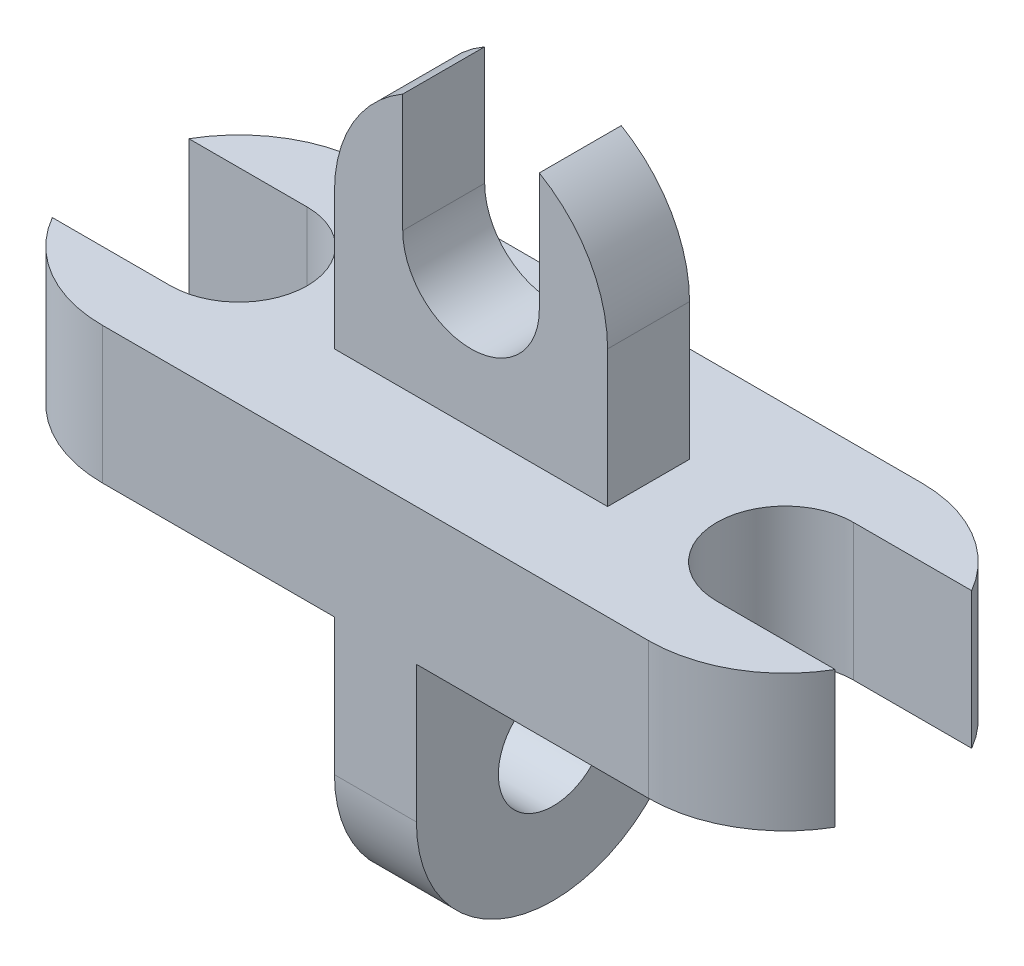
ISO-10303-21;
HEADER;
FILE_DESCRIPTION(('STEP AP214'),'2;1');
FILE_NAME('part.step','',(''),(''),'','','');
FILE_SCHEMA(('AUTOMOTIVE_DESIGN { 1 0 10303 214 1 1 1 1 }'));
ENDSEC;
DATA;
#1=APPLICATION_CONTEXT('core data for automotive mechanical design processes');
#2=APPLICATION_PROTOCOL_DEFINITION('international standard','automotive_design',2000,#1);
#3=PRODUCT_CONTEXT('',#1,'mechanical');
#4=PRODUCT('Part','Part','',(#3));
#5=PRODUCT_RELATED_PRODUCT_CATEGORY('part','',(#4));
#6=PRODUCT_DEFINITION_FORMATION('','',#4);
#7=PRODUCT_DEFINITION_CONTEXT('part definition',#1,'design');
#8=PRODUCT_DEFINITION('design','',#6,#7);
#9=PRODUCT_DEFINITION_SHAPE('','',#8);
#10=(LENGTH_UNIT() NAMED_UNIT(*) SI_UNIT(.MILLI.,.METRE.));
#11=(NAMED_UNIT(*) PLANE_ANGLE_UNIT() SI_UNIT($,.RADIAN.));
#12=(NAMED_UNIT(*) SI_UNIT($,.STERADIAN.) SOLID_ANGLE_UNIT());
#13=UNCERTAINTY_MEASURE_WITH_UNIT(LENGTH_MEASURE(1.E-05),#10,'distance_accuracy_value','');
#14=(GEOMETRIC_REPRESENTATION_CONTEXT(3) GLOBAL_UNCERTAINTY_ASSIGNED_CONTEXT((#13)) GLOBAL_UNIT_ASSIGNED_CONTEXT((#10,
#11,#12)) REPRESENTATION_CONTEXT('',''));
#15=CARTESIAN_POINT('',(0.,0.,0.));
#16=DIRECTION('',(0.,0.,1.));
#17=DIRECTION('',(1.,0.,0.));
#18=AXIS2_PLACEMENT_3D('',#15,#16,#17);
#19=CARTESIAN_POINT('',(-100.,-25.,0.));
#20=DIRECTION('',(0.,1.,0.));
#21=DIRECTION('',(0.,0.,1.));
#22=AXIS2_PLACEMENT_3D('',#19,#20,#21);
#23=CYLINDRICAL_SURFACE('',#22,50.);
#24=DIRECTION('',(0.,1.,0.));
#25=VECTOR('',#24,1.);
#26=CARTESIAN_POINT('',(-143.301270189222,-125.,-25.));
#27=LINE('',#26,#25);
#28=CARTESIAN_POINT('',(-143.301270189222,-25.,-25.));
#29=VERTEX_POINT('',#28);
#30=CARTESIAN_POINT('',(-143.301270189222,25.,-25.));
#31=VERTEX_POINT('',#30);
#32=EDGE_CURVE('E252',#29,#31,#27,.T.);
#33=ORIENTED_EDGE('',*,*,#32,.T.);
#34=CARTESIAN_POINT('',(-100.,25.,0.));
#35=DIRECTION('',(0.,1.,0.));
#36=DIRECTION('',(0.,0.,1.));
#37=AXIS2_PLACEMENT_3D('',#34,#35,#36);
#38=CIRCLE('',#37,50.);
#39=CARTESIAN_POINT('',(-100.,25.,-50.));
#40=VERTEX_POINT('',#39);
#41=EDGE_CURVE('E352',#40,#31,#38,.T.);
#42=ORIENTED_EDGE('',*,*,#41,.F.);
#43=DIRECTION('',(0.,1.,0.));
#44=VECTOR('',#43,1.);
#45=CARTESIAN_POINT('',(-100.,-25.,-50.));
#46=LINE('',#45,#44);
#47=CARTESIAN_POINT('',(-100.,-25.,-50.));
#48=VERTEX_POINT('',#47);
#49=EDGE_CURVE('E390',#48,#40,#46,.T.);
#50=ORIENTED_EDGE('',*,*,#49,.F.);
#51=CARTESIAN_POINT('',(-100.,-25.,0.));
#52=DIRECTION('',(0.,1.,0.));
#53=DIRECTION('',(0.,0.,1.));
#54=AXIS2_PLACEMENT_3D('',#51,#52,#53);
#55=CIRCLE('',#54,50.);
#56=EDGE_CURVE('E370',#48,#29,#55,.T.);
#57=ORIENTED_EDGE('',*,*,#56,.T.);
#58=EDGE_LOOP('',(#33,#42,#50,#57));
#59=FACE_BOUND('',#58,.T.);
#60=ADVANCED_FACE('F45',(#59),#23,.T.);
#61=CARTESIAN_POINT('',(100.,-25.,0.));
#62=DIRECTION('',(0.,1.,0.));
#63=DIRECTION('',(0.,0.,1.));
#64=AXIS2_PLACEMENT_3D('',#61,#62,#63);
#65=CYLINDRICAL_SURFACE('',#64,50.);
#66=DIRECTION('',(0.,1.,0.));
#67=VECTOR('',#66,1.);
#68=CARTESIAN_POINT('',(143.301270189222,-25.,-25.));
#69=LINE('',#68,#67);
#70=CARTESIAN_POINT('',(143.301270189222,-25.,-25.));
#71=VERTEX_POINT('',#70);
#72=CARTESIAN_POINT('',(143.301270189222,25.,-25.));
#73=VERTEX_POINT('',#72);
#74=EDGE_CURVE('E459',#71,#73,#69,.T.);
#75=ORIENTED_EDGE('',*,*,#74,.F.);
#76=CARTESIAN_POINT('',(100.,-25.,0.));
#77=DIRECTION('',(0.,1.,0.));
#78=DIRECTION('',(0.,0.,1.));
#79=AXIS2_PLACEMENT_3D('',#76,#77,#78);
#80=CIRCLE('',#79,50.);
#81=CARTESIAN_POINT('',(100.,-25.,-50.0000000000001));
#82=VERTEX_POINT('',#81);
#83=EDGE_CURVE('E379',#71,#82,#80,.T.);
#84=ORIENTED_EDGE('',*,*,#83,.T.);
#85=DIRECTION('',(0.,1.,0.));
#86=VECTOR('',#85,1.);
#87=CARTESIAN_POINT('',(100.,-25.,-50.0000000000001));
#88=LINE('',#87,#86);
#89=CARTESIAN_POINT('',(100.,25.,-50.0000000000001));
#90=VERTEX_POINT('',#89);
#91=EDGE_CURVE('E394',#82,#90,#88,.T.);
#92=ORIENTED_EDGE('',*,*,#91,.T.);
#93=CARTESIAN_POINT('',(100.,25.,0.));
#94=DIRECTION('',(0.,1.,0.));
#95=DIRECTION('',(0.,0.,1.));
#96=AXIS2_PLACEMENT_3D('',#93,#94,#95);
#97=CIRCLE('',#96,50.);
#98=EDGE_CURVE('E360',#73,#90,#97,.T.);
#99=ORIENTED_EDGE('',*,*,#98,.F.);
#100=EDGE_LOOP('',(#75,#84,#92,#99));
#101=FACE_BOUND('',#100,.T.);
#102=ADVANCED_FACE('F503',(#101),#65,.T.);
#103=CARTESIAN_POINT('',(-100.,25.,0.));
#104=DIRECTION('',(0.,1.,0.));
#105=DIRECTION('',(0.,0.,1.));
#106=AXIS2_PLACEMENT_3D('',#103,#104,#105);
#107=PLANE('',#106);
#108=DIRECTION('',(-1.,0.,0.));
#109=VECTOR('',#108,1.);
#110=CARTESIAN_POINT('',(100.,25.,-25.));
#111=LINE('',#110,#109);
#112=CARTESIAN_POINT('',(100.,25.,-25.));
#113=VERTEX_POINT('',#112);
#114=EDGE_CURVE('E260',#73,#113,#111,.T.);
#115=ORIENTED_EDGE('',*,*,#114,.F.);
#116=ORIENTED_EDGE('',*,*,#98,.T.);
#117=DIRECTION('',(-1.,0.,0.));
#118=VECTOR('',#117,1.);
#119=CARTESIAN_POINT('',(-100.,25.,-50.));
#120=LINE('',#119,#118);
#121=EDGE_CURVE('E365',#90,#40,#120,.T.);
#122=ORIENTED_EDGE('',*,*,#121,.T.);
#123=ORIENTED_EDGE('',*,*,#41,.T.);
#124=DIRECTION('',(-1.,0.,0.));
#125=VECTOR('',#124,1.);
#126=CARTESIAN_POINT('',(-100.,25.,-25.));
#127=LINE('',#126,#125);
#128=CARTESIAN_POINT('',(-100.,25.,-25.));
#129=VERTEX_POINT('',#128);
#130=EDGE_CURVE('E274',#129,#31,#127,.T.);
#131=ORIENTED_EDGE('',*,*,#130,.F.);
#132=CARTESIAN_POINT('',(-100.,25.,0.));
#133=DIRECTION('',(0.,1.,0.));
#134=DIRECTION('',(0.,0.,1.));
#135=AXIS2_PLACEMENT_3D('',#132,#133,#134);
#136=CIRCLE('',#135,25.);
#137=CARTESIAN_POINT('',(-100.,25.,25.));
#138=VERTEX_POINT('',#137);
#139=EDGE_CURVE('E286',#138,#129,#136,.T.);
#140=ORIENTED_EDGE('',*,*,#139,.F.);
#141=DIRECTION('',(1.,0.,0.));
#142=VECTOR('',#141,1.);
#143=CARTESIAN_POINT('',(-100.,25.,25.));
#144=LINE('',#143,#142);
#145=CARTESIAN_POINT('',(-143.301270189222,25.,25.));
#146=VERTEX_POINT('',#145);
#147=EDGE_CURVE('E257',#146,#138,#144,.T.);
#148=ORIENTED_EDGE('',*,*,#147,.F.);
#149=CARTESIAN_POINT('',(-100.,25.,50.));
#150=VERTEX_POINT('',#149);
#151=EDGE_CURVE('E351',#146,#150,#38,.T.);
#152=ORIENTED_EDGE('',*,*,#151,.T.);
#153=DIRECTION('',(1.,0.,0.));
#154=VECTOR('',#153,1.);
#155=CARTESIAN_POINT('',(-100.,25.,50.));
#156=LINE('',#155,#154);
#157=CARTESIAN_POINT('',(100.,25.,50.));
#158=VERTEX_POINT('',#157);
#159=EDGE_CURVE('E356',#150,#158,#156,.T.);
#160=ORIENTED_EDGE('',*,*,#159,.T.);
#161=CARTESIAN_POINT('',(143.301270189222,25.,25.));
#162=VERTEX_POINT('',#161);
#163=EDGE_CURVE('E361',#158,#162,#97,.T.);
#164=ORIENTED_EDGE('',*,*,#163,.T.);
#165=DIRECTION('',(1.,0.,0.));
#166=VECTOR('',#165,1.);
#167=CARTESIAN_POINT('',(100.,25.,25.));
#168=LINE('',#167,#166);
#169=CARTESIAN_POINT('',(100.,25.,25.));
#170=VERTEX_POINT('',#169);
#171=EDGE_CURVE('E69',#170,#162,#168,.T.);
#172=ORIENTED_EDGE('',*,*,#171,.F.);
#173=CARTESIAN_POINT('',(100.,25.,0.));
#174=DIRECTION('',(0.,1.,0.));
#175=DIRECTION('',(0.,0.,-1.));
#176=AXIS2_PLACEMENT_3D('',#173,#174,#175);
#177=CIRCLE('',#176,25.);
#178=EDGE_CURVE('E253',#113,#170,#177,.T.);
#179=ORIENTED_EDGE('',*,*,#178,.F.);
#180=EDGE_LOOP('',(#115,#116,#122,#123,#131,#140,#148,#152,#160,#164,#172,#179));
#181=FACE_BOUND('',#180,.T.);
#182=DIRECTION('',(1.,0.,0.));
#183=VECTOR('',#182,1.);
#184=CARTESIAN_POINT('',(-50.,25.,-15.));
#185=LINE('',#184,#183);
#186=CARTESIAN_POINT('',(-50.,25.,-15.));
#187=VERTEX_POINT('',#186);
#188=CARTESIAN_POINT('',(50.,25.,-15.));
#189=VERTEX_POINT('',#188);
#190=EDGE_CURVE('E313',#187,#189,#185,.T.);
#191=ORIENTED_EDGE('',*,*,#190,.T.);
#192=DIRECTION('',(0.,0.,1.));
#193=VECTOR('',#192,1.);
#194=CARTESIAN_POINT('',(50.,25.,-15.));
#195=LINE('',#194,#193);
#196=CARTESIAN_POINT('',(50.,25.,15.));
#197=VERTEX_POINT('',#196);
#198=EDGE_CURVE('E322',#189,#197,#195,.T.);
#199=ORIENTED_EDGE('',*,*,#198,.T.);
#200=DIRECTION('',(1.,0.,0.));
#201=VECTOR('',#200,1.);
#202=CARTESIAN_POINT('',(-50.,25.,15.));
#203=LINE('',#202,#201);
#204=CARTESIAN_POINT('',(-50.,25.,15.));
#205=VERTEX_POINT('',#204);
#206=EDGE_CURVE('E303',#205,#197,#203,.T.);
#207=ORIENTED_EDGE('',*,*,#206,.F.);
#208=DIRECTION('',(0.,0.,1.));
#209=VECTOR('',#208,1.);
#210=CARTESIAN_POINT('',(-50.,25.,-15.));
#211=LINE('',#210,#209);
#212=EDGE_CURVE('E321',#187,#205,#211,.T.);
#213=ORIENTED_EDGE('',*,*,#212,.F.);
#214=EDGE_LOOP('',(#191,#199,#207,#213));
#215=FACE_BOUND('',#214,.T.);
#216=ADVANCED_FACE('F482',(#181,#215),#107,.T.);
#217=CARTESIAN_POINT('',(-100.,-25.,0.));
#218=DIRECTION('',(0.,1.,0.));
#219=DIRECTION('',(0.,0.,1.));
#220=AXIS2_PLACEMENT_3D('',#217,#218,#219);
#221=PLANE('',#220);
#222=ORIENTED_EDGE('',*,*,#83,.F.);
#223=DIRECTION('',(-1.,0.,0.));
#224=VECTOR('',#223,1.);
#225=CARTESIAN_POINT('',(-100.,-25.,-25.));
#226=LINE('',#225,#224);
#227=CARTESIAN_POINT('',(100.,-25.,-25.));
#228=VERTEX_POINT('',#227);
#229=EDGE_CURVE('E296',#71,#228,#226,.T.);
#230=ORIENTED_EDGE('',*,*,#229,.T.);
#231=CARTESIAN_POINT('',(100.,-25.,0.));
#232=DIRECTION('',(0.,1.,0.));
#233=DIRECTION('',(0.,0.,1.));
#234=AXIS2_PLACEMENT_3D('',#231,#232,#233);
#235=CIRCLE('',#234,25.);
#236=CARTESIAN_POINT('',(100.,-25.,25.));
#237=VERTEX_POINT('',#236);
#238=EDGE_CURVE('E462',#228,#237,#235,.T.);
#239=ORIENTED_EDGE('',*,*,#238,.T.);
#240=DIRECTION('',(1.,0.,0.));
#241=VECTOR('',#240,1.);
#242=CARTESIAN_POINT('',(-100.,-25.,25.));
#243=LINE('',#242,#241);
#244=CARTESIAN_POINT('',(143.301270189222,-25.,25.));
#245=VERTEX_POINT('',#244);
#246=EDGE_CURVE('E268',#237,#245,#243,.T.);
#247=ORIENTED_EDGE('',*,*,#246,.T.);
#248=CARTESIAN_POINT('',(100.,-25.,50.));
#249=VERTEX_POINT('',#248);
#250=EDGE_CURVE('E380',#249,#245,#80,.T.);
#251=ORIENTED_EDGE('',*,*,#250,.F.);
#252=DIRECTION('',(1.,0.,0.));
#253=VECTOR('',#252,1.);
#254=CARTESIAN_POINT('',(-100.,-25.,50.));
#255=LINE('',#254,#253);
#256=CARTESIAN_POINT('',(15.,-25.,50.));
#257=VERTEX_POINT('',#256);
#258=EDGE_CURVE('E374',#257,#249,#255,.T.);
#259=ORIENTED_EDGE('',*,*,#258,.F.);
#260=DIRECTION('',(0.,0.,1.));
#261=VECTOR('',#260,1.);
#262=CARTESIAN_POINT('',(15.,-25.,50.));
#263=LINE('',#262,#261);
#264=CARTESIAN_POINT('',(15.,-25.,-50.0000000000001));
#265=VERTEX_POINT('',#264);
#266=EDGE_CURVE('E337',#265,#257,#263,.T.);
#267=ORIENTED_EDGE('',*,*,#266,.F.);
#268=DIRECTION('',(-1.,0.,0.));
#269=VECTOR('',#268,1.);
#270=CARTESIAN_POINT('',(-100.,-25.,-50.));
#271=LINE('',#270,#269);
#272=EDGE_CURVE('E385',#82,#265,#271,.T.);
#273=ORIENTED_EDGE('',*,*,#272,.F.);
#274=EDGE_LOOP('',(#222,#230,#239,#247,#251,#259,#267,#273));
#275=FACE_BOUND('',#274,.T.);
#276=ADVANCED_FACE('F518',(#275),#221,.F.);
#277=DIRECTION('',(0.,1.,0.));
#278=VECTOR('',#277,1.);
#279=CARTESIAN_POINT('',(-143.301270189222,-125.,25.));
#280=LINE('',#279,#278);
#281=CARTESIAN_POINT('',(-143.301270189222,-25.,25.));
#282=VERTEX_POINT('',#281);
#283=EDGE_CURVE('E271',#282,#146,#280,.T.);
#284=ORIENTED_EDGE('',*,*,#283,.F.);
#285=CARTESIAN_POINT('',(-100.,-25.,50.));
#286=VERTEX_POINT('',#285);
#287=EDGE_CURVE('E369',#282,#286,#55,.T.);
#288=ORIENTED_EDGE('',*,*,#287,.T.);
#289=DIRECTION('',(0.,1.,0.));
#290=VECTOR('',#289,1.);
#291=CARTESIAN_POINT('',(-100.,-25.,50.));
#292=LINE('',#291,#290);
#293=EDGE_CURVE('E389',#286,#150,#292,.T.);
#294=ORIENTED_EDGE('',*,*,#293,.T.);
#295=ORIENTED_EDGE('',*,*,#151,.F.);
#296=EDGE_LOOP('',(#284,#288,#294,#295));
#297=FACE_BOUND('',#296,.T.);
#298=ADVANCED_FACE('F506',(#297),#23,.T.);
#299=CARTESIAN_POINT('',(-100.,-25.,-50.));
#300=DIRECTION('',(0.,0.,-1.));
#301=DIRECTION('',(-1.,0.,0.));
#302=AXIS2_PLACEMENT_3D('',#299,#300,#301);
#303=PLANE('',#302);
#304=DIRECTION('',(0.,1.,0.));
#305=VECTOR('',#304,1.);
#306=CARTESIAN_POINT('',(15.,-25.,-50.0000000000001));
#307=LINE('',#306,#305);
#308=CARTESIAN_POINT('',(15.,-75.,-50.0000000000001));
#309=VERTEX_POINT('',#308);
#310=EDGE_CURVE('E334',#309,#265,#307,.T.);
#311=ORIENTED_EDGE('',*,*,#310,.F.);
#312=DIRECTION('',(1.,0.,0.));
#313=VECTOR('',#312,1.);
#314=CARTESIAN_POINT('',(-100.,-75.,-50.));
#315=LINE('',#314,#313);
#316=CARTESIAN_POINT('',(-15.,-75.,-50.0000000000001));
#317=VERTEX_POINT('',#316);
#318=EDGE_CURVE('E409',#309,#317,#315,.F.);
#319=ORIENTED_EDGE('',*,*,#318,.T.);
#320=DIRECTION('',(0.,1.,0.));
#321=VECTOR('',#320,1.);
#322=CARTESIAN_POINT('',(-15.,-25.,-50.0000000000001));
#323=LINE('',#322,#321);
#324=CARTESIAN_POINT('',(-15.,-25.,-50.0000000000001));
#325=VERTEX_POINT('',#324);
#326=EDGE_CURVE('E344',#317,#325,#323,.T.);
#327=ORIENTED_EDGE('',*,*,#326,.T.);
#328=EDGE_CURVE('E384',#325,#48,#271,.T.);
#329=ORIENTED_EDGE('',*,*,#328,.T.);
#330=ORIENTED_EDGE('',*,*,#49,.T.);
#331=ORIENTED_EDGE('',*,*,#121,.F.);
#332=ORIENTED_EDGE('',*,*,#91,.F.);
#333=ORIENTED_EDGE('',*,*,#272,.T.);
#334=EDGE_LOOP('',(#311,#319,#327,#329,#330,#331,#332,#333));
#335=FACE_BOUND('',#334,.T.);
#336=ADVANCED_FACE('F517',(#335),#303,.T.);
#337=DIRECTION('',(0.,1.,0.));
#338=VECTOR('',#337,1.);
#339=CARTESIAN_POINT('',(143.301270189222,-25.,25.));
#340=LINE('',#339,#338);
#341=EDGE_CURVE('E456',#162,#245,#340,.F.);
#342=ORIENTED_EDGE('',*,*,#341,.F.);
#343=ORIENTED_EDGE('',*,*,#163,.F.);
#344=DIRECTION('',(0.,1.,0.));
#345=VECTOR('',#344,1.);
#346=CARTESIAN_POINT('',(100.,-25.,50.));
#347=LINE('',#346,#345);
#348=EDGE_CURVE('E398',#249,#158,#347,.T.);
#349=ORIENTED_EDGE('',*,*,#348,.F.);
#350=ORIENTED_EDGE('',*,*,#250,.T.);
#351=EDGE_LOOP('',(#342,#343,#349,#350));
#352=FACE_BOUND('',#351,.T.);
#353=ADVANCED_FACE('F513',(#352),#65,.T.);
#354=CARTESIAN_POINT('',(-100.,-25.,50.));
#355=DIRECTION('',(0.,0.,1.));
#356=DIRECTION('',(1.,0.,0.));
#357=AXIS2_PLACEMENT_3D('',#354,#355,#356);
#358=PLANE('',#357);
#359=DIRECTION('',(0.,-1.,0.));
#360=VECTOR('',#359,1.);
#361=CARTESIAN_POINT('',(-15.,-25.,50.));
#362=LINE('',#361,#360);
#363=CARTESIAN_POINT('',(-15.,-25.,50.));
#364=VERTEX_POINT('',#363);
#365=CARTESIAN_POINT('',(-15.,-75.,50.));
#366=VERTEX_POINT('',#365);
#367=EDGE_CURVE('E340',#364,#366,#362,.T.);
#368=ORIENTED_EDGE('',*,*,#367,.T.);
#369=DIRECTION('',(1.,0.,0.));
#370=VECTOR('',#369,1.);
#371=CARTESIAN_POINT('',(-100.,-75.,50.));
#372=LINE('',#371,#370);
#373=CARTESIAN_POINT('',(15.,-75.,50.));
#374=VERTEX_POINT('',#373);
#375=EDGE_CURVE('E419',#366,#374,#372,.T.);
#376=ORIENTED_EDGE('',*,*,#375,.T.);
#377=DIRECTION('',(0.,-1.,0.));
#378=VECTOR('',#377,1.);
#379=CARTESIAN_POINT('',(15.,-25.,50.));
#380=LINE('',#379,#378);
#381=EDGE_CURVE('E330',#257,#374,#380,.T.);
#382=ORIENTED_EDGE('',*,*,#381,.F.);
#383=ORIENTED_EDGE('',*,*,#258,.T.);
#384=ORIENTED_EDGE('',*,*,#348,.T.);
#385=ORIENTED_EDGE('',*,*,#159,.F.);
#386=ORIENTED_EDGE('',*,*,#293,.F.);
#387=EDGE_CURVE('E375',#286,#364,#255,.T.);
#388=ORIENTED_EDGE('',*,*,#387,.T.);
#389=EDGE_LOOP('',(#368,#376,#382,#383,#384,#385,#386,#388));
#390=FACE_BOUND('',#389,.T.);
#391=ADVANCED_FACE('F548',(#390),#358,.T.);
#392=CARTESIAN_POINT('',(-100.,-25.,0.));
#393=DIRECTION('',(0.,1.,0.));
#394=DIRECTION('',(0.,0.,1.));
#395=AXIS2_PLACEMENT_3D('',#392,#393,#394);
#396=CIRCLE('',#395,25.);
#397=CARTESIAN_POINT('',(-100.,-25.,25.));
#398=VERTEX_POINT('',#397);
#399=CARTESIAN_POINT('',(-100.,-25.,-25.));
#400=VERTEX_POINT('',#399);
#401=EDGE_CURVE('E448',#398,#400,#396,.T.);
#402=ORIENTED_EDGE('',*,*,#401,.T.);
#403=DIRECTION('',(-1.,0.,0.));
#404=VECTOR('',#403,1.);
#405=CARTESIAN_POINT('',(-100.,-25.,-25.));
#406=LINE('',#405,#404);
#407=EDGE_CURVE('E452',#400,#29,#406,.T.);
#408=ORIENTED_EDGE('',*,*,#407,.T.);
#409=ORIENTED_EDGE('',*,*,#56,.F.);
#410=ORIENTED_EDGE('',*,*,#328,.F.);
#411=DIRECTION('',(0.,0.,1.));
#412=VECTOR('',#411,1.);
#413=CARTESIAN_POINT('',(-15.,-25.,50.));
#414=LINE('',#413,#412);
#415=EDGE_CURVE('E347',#325,#364,#414,.T.);
#416=ORIENTED_EDGE('',*,*,#415,.T.);
#417=ORIENTED_EDGE('',*,*,#387,.F.);
#418=ORIENTED_EDGE('',*,*,#287,.F.);
#419=DIRECTION('',(1.,0.,0.));
#420=VECTOR('',#419,1.);
#421=CARTESIAN_POINT('',(-100.,-25.,25.));
#422=LINE('',#421,#420);
#423=EDGE_CURVE('E444',#282,#398,#422,.T.);
#424=ORIENTED_EDGE('',*,*,#423,.T.);
#425=EDGE_LOOP('',(#402,#408,#409,#410,#416,#417,#418,#424));
#426=FACE_BOUND('',#425,.T.);
#427=ADVANCED_FACE('F529',(#426),#221,.F.);
#428=CARTESIAN_POINT('',(-15.,0.,0.));
#429=DIRECTION('',(1.,0.,0.));
#430=DIRECTION('',(0.,0.,-1.));
#431=AXIS2_PLACEMENT_3D('',#428,#429,#430);
#432=PLANE('',#431);
#433=CARTESIAN_POINT('',(-15.,-75.,0.));
#434=DIRECTION('',(1.,0.,0.));
#435=DIRECTION('',(0.,0.,-1.));
#436=AXIS2_PLACEMENT_3D('',#433,#434,#435);
#437=CIRCLE('',#436,20.);
#438=CARTESIAN_POINT('',(-15.,-75.,-20.));
#439=VERTEX_POINT('',#438);
#440=EDGE_CURVE('E233',#439,#439,#437,.T.);
#441=ORIENTED_EDGE('',*,*,#440,.T.);
#442=EDGE_LOOP('',(#441));
#443=FACE_BOUND('',#442,.T.);
#444=ORIENTED_EDGE('',*,*,#326,.F.);
#445=CARTESIAN_POINT('',(-15.,-75.,0.));
#446=DIRECTION('',(1.,0.,0.));
#447=DIRECTION('',(0.,0.,-1.));
#448=AXIS2_PLACEMENT_3D('',#445,#446,#447);
#449=CIRCLE('',#448,50.);
#450=CARTESIAN_POINT('',(-15.,-125.,0.));
#451=VERTEX_POINT('',#450);
#452=EDGE_CURVE('E416',#317,#451,#449,.F.);
#453=ORIENTED_EDGE('',*,*,#452,.T.);
#454=CARTESIAN_POINT('',(-15.,-75.,0.));
#455=DIRECTION('',(1.,0.,0.));
#456=DIRECTION('',(0.,0.,-1.));
#457=AXIS2_PLACEMENT_3D('',#454,#455,#456);
#458=CIRCLE('',#457,50.);
#459=EDGE_CURVE('E413',#451,#366,#458,.F.);
#460=ORIENTED_EDGE('',*,*,#459,.T.);
#461=ORIENTED_EDGE('',*,*,#367,.F.);
#462=ORIENTED_EDGE('',*,*,#415,.F.);
#463=EDGE_LOOP('',(#444,#453,#460,#461,#462));
#464=FACE_BOUND('',#463,.T.);
#465=ADVANCED_FACE('F606',(#443,#464),#432,.F.);
#466=CARTESIAN_POINT('',(15.,0.,0.));
#467=DIRECTION('',(1.,0.,0.));
#468=DIRECTION('',(0.,0.,-1.));
#469=AXIS2_PLACEMENT_3D('',#466,#467,#468);
#470=PLANE('',#469);
#471=CARTESIAN_POINT('',(15.,-75.,0.));
#472=DIRECTION('',(1.,0.,0.));
#473=DIRECTION('',(0.,0.,-1.));
#474=AXIS2_PLACEMENT_3D('',#471,#472,#473);
#475=CIRCLE('',#474,20.);
#476=CARTESIAN_POINT('',(15.,-75.,-20.));
#477=VERTEX_POINT('',#476);
#478=EDGE_CURVE('E812',#477,#477,#475,.T.);
#479=ORIENTED_EDGE('',*,*,#478,.F.);
#480=EDGE_LOOP('',(#479));
#481=FACE_BOUND('',#480,.T.);
#482=CARTESIAN_POINT('',(15.,-75.,0.));
#483=DIRECTION('',(1.,0.,0.));
#484=DIRECTION('',(0.,0.,-1.));
#485=AXIS2_PLACEMENT_3D('',#482,#483,#484);
#486=CIRCLE('',#485,50.);
#487=CARTESIAN_POINT('',(15.,-125.,0.));
#488=VERTEX_POINT('',#487);
#489=EDGE_CURVE('E393',#374,#488,#486,.T.);
#490=ORIENTED_EDGE('',*,*,#489,.T.);
#491=CARTESIAN_POINT('',(15.,-75.,0.));
#492=DIRECTION('',(1.,0.,0.));
#493=DIRECTION('',(0.,0.,-1.));
#494=AXIS2_PLACEMENT_3D('',#491,#492,#493);
#495=CIRCLE('',#494,50.);
#496=EDGE_CURVE('E406',#488,#309,#495,.T.);
#497=ORIENTED_EDGE('',*,*,#496,.T.);
#498=ORIENTED_EDGE('',*,*,#310,.T.);
#499=ORIENTED_EDGE('',*,*,#266,.T.);
#500=ORIENTED_EDGE('',*,*,#381,.T.);
#501=EDGE_LOOP('',(#490,#497,#498,#499,#500));
#502=FACE_BOUND('',#501,.T.);
#503=ADVANCED_FACE('F602',(#481,#502),#470,.T.);
#504=CARTESIAN_POINT('',(-100.,-75.,0.));
#505=DIRECTION('',(1.,0.,0.));
#506=DIRECTION('',(0.,0.,-1.));
#507=AXIS2_PLACEMENT_3D('',#504,#505,#506);
#508=CYLINDRICAL_SURFACE('',#507,50.);
#509=ORIENTED_EDGE('',*,*,#375,.F.);
#510=ORIENTED_EDGE('',*,*,#459,.F.);
#511=DIRECTION('',(1.,0.,0.));
#512=VECTOR('',#511,1.);
#513=CARTESIAN_POINT('',(-15.,-125.,0.));
#514=LINE('',#513,#512);
#515=EDGE_CURVE('E326',#488,#451,#514,.F.);
#516=ORIENTED_EDGE('',*,*,#515,.F.);
#517=ORIENTED_EDGE('',*,*,#489,.F.);
#518=EDGE_LOOP('',(#509,#510,#516,#517));
#519=FACE_BOUND('',#518,.T.);
#520=ADVANCED_FACE('F605',(#519),#508,.T.);
#521=CARTESIAN_POINT('',(-15.,-75.,0.));
#522=DIRECTION('',(1.,0.,0.));
#523=DIRECTION('',(0.,0.,-1.));
#524=AXIS2_PLACEMENT_3D('',#521,#522,#523);
#525=CYLINDRICAL_SURFACE('',#524,50.);
#526=ORIENTED_EDGE('',*,*,#452,.F.);
#527=ORIENTED_EDGE('',*,*,#318,.F.);
#528=ORIENTED_EDGE('',*,*,#496,.F.);
#529=ORIENTED_EDGE('',*,*,#515,.T.);
#530=EDGE_LOOP('',(#526,#527,#528,#529));
#531=FACE_BOUND('',#530,.T.);
#532=ADVANCED_FACE('F601',(#531),#525,.T.);
#533=CARTESIAN_POINT('',(-50.,25.,-15.));
#534=DIRECTION('',(-1.,0.,0.));
#535=DIRECTION('',(0.,0.,1.));
#536=AXIS2_PLACEMENT_3D('',#533,#534,#535);
#537=PLANE('',#536);
#538=DIRECTION('',(0.,-1.,0.));
#539=VECTOR('',#538,1.);
#540=CARTESIAN_POINT('',(-50.,25.,15.));
#541=LINE('',#540,#539);
#542=CARTESIAN_POINT('',(-50.,75.,15.));
#543=VERTEX_POINT('',#542);
#544=EDGE_CURVE('E300',#543,#205,#541,.T.);
#545=ORIENTED_EDGE('',*,*,#544,.F.);
#546=DIRECTION('',(0.,0.,1.));
#547=VECTOR('',#546,1.);
#548=CARTESIAN_POINT('',(-50.,75.,-15.));
#549=LINE('',#548,#547);
#550=CARTESIAN_POINT('',(-50.,75.,-15.));
#551=VERTEX_POINT('',#550);
#552=EDGE_CURVE('E441',#543,#551,#549,.F.);
#553=ORIENTED_EDGE('',*,*,#552,.T.);
#554=DIRECTION('',(0.,-1.,0.));
#555=VECTOR('',#554,1.);
#556=CARTESIAN_POINT('',(-50.,25.,-15.));
#557=LINE('',#556,#555);
#558=EDGE_CURVE('E310',#551,#187,#557,.T.);
#559=ORIENTED_EDGE('',*,*,#558,.T.);
#560=ORIENTED_EDGE('',*,*,#212,.T.);
#561=EDGE_LOOP('',(#545,#553,#559,#560));
#562=FACE_BOUND('',#561,.T.);
#563=ADVANCED_FACE('F476',(#562),#537,.T.);
#564=CARTESIAN_POINT('',(50.,25.,-15.));
#565=DIRECTION('',(1.,0.,0.));
#566=DIRECTION('',(0.,0.,-1.));
#567=AXIS2_PLACEMENT_3D('',#564,#565,#566);
#568=PLANE('',#567);
#569=DIRECTION('',(0.,1.,0.));
#570=VECTOR('',#569,1.);
#571=CARTESIAN_POINT('',(50.,25.,-15.));
#572=LINE('',#571,#570);
#573=CARTESIAN_POINT('',(50.,75.,-15.));
#574=VERTEX_POINT('',#573);
#575=EDGE_CURVE('E317',#189,#574,#572,.T.);
#576=ORIENTED_EDGE('',*,*,#575,.T.);
#577=DIRECTION('',(0.,0.,1.));
#578=VECTOR('',#577,1.);
#579=CARTESIAN_POINT('',(50.,75.,-15.));
#580=LINE('',#579,#578);
#581=CARTESIAN_POINT('',(50.,75.,15.));
#582=VERTEX_POINT('',#581);
#583=EDGE_CURVE('E422',#574,#582,#580,.T.);
#584=ORIENTED_EDGE('',*,*,#583,.T.);
#585=DIRECTION('',(0.,1.,0.));
#586=VECTOR('',#585,1.);
#587=CARTESIAN_POINT('',(50.,25.,15.));
#588=LINE('',#587,#586);
#589=EDGE_CURVE('E306',#197,#582,#588,.T.);
#590=ORIENTED_EDGE('',*,*,#589,.F.);
#591=ORIENTED_EDGE('',*,*,#198,.F.);
#592=EDGE_LOOP('',(#576,#584,#590,#591));
#593=FACE_BOUND('',#592,.T.);
#594=ADVANCED_FACE('F485',(#593),#568,.T.);
#595=CARTESIAN_POINT('',(0.,0.,-15.));
#596=DIRECTION('',(0.,0.,-1.));
#597=DIRECTION('',(-1.,0.,0.));
#598=AXIS2_PLACEMENT_3D('',#595,#596,#597);
#599=PLANE('',#598);
#600=DIRECTION('',(0.,-1.,0.));
#601=VECTOR('',#600,1.);
#602=CARTESIAN_POINT('',(25.,75.,-15.));
#603=LINE('',#602,#601);
#604=CARTESIAN_POINT('',(25.,118.301270189222,-15.));
#605=VERTEX_POINT('',#604);
#606=CARTESIAN_POINT('',(25.,75.,-15.));
#607=VERTEX_POINT('',#606);
#608=EDGE_CURVE('E224',#605,#607,#603,.T.);
#609=ORIENTED_EDGE('',*,*,#608,.F.);
#610=CARTESIAN_POINT('',(0.,75.,-15.));
#611=DIRECTION('',(0.,0.,-1.));
#612=DIRECTION('',(-1.,0.,0.));
#613=AXIS2_PLACEMENT_3D('',#610,#611,#612);
#614=CIRCLE('',#613,50.);
#615=EDGE_CURVE('E438',#605,#574,#614,.T.);
#616=ORIENTED_EDGE('',*,*,#615,.T.);
#617=ORIENTED_EDGE('',*,*,#575,.F.);
#618=ORIENTED_EDGE('',*,*,#190,.F.);
#619=ORIENTED_EDGE('',*,*,#558,.F.);
#620=CARTESIAN_POINT('',(0.,75.,-15.));
#621=DIRECTION('',(0.,0.,-1.));
#622=DIRECTION('',(-1.,0.,0.));
#623=AXIS2_PLACEMENT_3D('',#620,#621,#622);
#624=CIRCLE('',#623,50.);
#625=CARTESIAN_POINT('',(-25.,118.301270189222,-15.));
#626=VERTEX_POINT('',#625);
#627=EDGE_CURVE('E239',#551,#626,#624,.T.);
#628=ORIENTED_EDGE('',*,*,#627,.T.);
#629=DIRECTION('',(0.,1.,0.));
#630=VECTOR('',#629,1.);
#631=CARTESIAN_POINT('',(-25.,75.,-15.));
#632=LINE('',#631,#630);
#633=CARTESIAN_POINT('',(-25.,75.,-15.));
#634=VERTEX_POINT('',#633);
#635=EDGE_CURVE('E217',#634,#626,#632,.T.);
#636=ORIENTED_EDGE('',*,*,#635,.F.);
#637=CARTESIAN_POINT('',(0.,75.,-15.));
#638=DIRECTION('',(0.,0.,-1.));
#639=DIRECTION('',(-1.,0.,0.));
#640=AXIS2_PLACEMENT_3D('',#637,#638,#639);
#641=CIRCLE('',#640,25.);
#642=EDGE_CURVE('E227',#607,#634,#641,.T.);
#643=ORIENTED_EDGE('',*,*,#642,.F.);
#644=EDGE_LOOP('',(#609,#616,#617,#618,#619,#628,#636,#643));
#645=FACE_BOUND('',#644,.T.);
#646=ADVANCED_FACE('F236',(#645),#599,.T.);
#647=CARTESIAN_POINT('',(0.,0.,15.));
#648=DIRECTION('',(0.,0.,-1.));
#649=DIRECTION('',(-1.,0.,0.));
#650=AXIS2_PLACEMENT_3D('',#647,#648,#649);
#651=PLANE('',#650);
#652=CARTESIAN_POINT('',(0.,75.,15.));
#653=DIRECTION('',(0.,0.,-1.));
#654=DIRECTION('',(-1.,0.,0.));
#655=AXIS2_PLACEMENT_3D('',#652,#653,#654);
#656=CIRCLE('',#655,50.);
#657=CARTESIAN_POINT('',(25.,118.301270189222,15.));
#658=VERTEX_POINT('',#657);
#659=EDGE_CURVE('E432',#582,#658,#656,.F.);
#660=ORIENTED_EDGE('',*,*,#659,.T.);
#661=DIRECTION('',(0.,-1.,0.));
#662=VECTOR('',#661,1.);
#663=CARTESIAN_POINT('',(25.,0.,15.));
#664=LINE('',#663,#662);
#665=CARTESIAN_POINT('',(25.,75.,15.));
#666=VERTEX_POINT('',#665);
#667=EDGE_CURVE('E61',#658,#666,#664,.T.);
#668=ORIENTED_EDGE('',*,*,#667,.T.);
#669=CARTESIAN_POINT('',(0.,75.,15.));
#670=DIRECTION('',(0.,0.,-1.));
#671=DIRECTION('',(-1.,0.,0.));
#672=AXIS2_PLACEMENT_3D('',#669,#670,#671);
#673=CIRCLE('',#672,25.);
#674=CARTESIAN_POINT('',(-25.,75.,15.));
#675=VERTEX_POINT('',#674);
#676=EDGE_CURVE('E11',#666,#675,#673,.T.);
#677=ORIENTED_EDGE('',*,*,#676,.T.);
#678=DIRECTION('',(0.,1.,0.));
#679=VECTOR('',#678,1.);
#680=CARTESIAN_POINT('',(-25.,0.,15.));
#681=LINE('',#680,#679);
#682=CARTESIAN_POINT('',(-25.,118.301270189222,15.));
#683=VERTEX_POINT('',#682);
#684=EDGE_CURVE('E220',#675,#683,#681,.T.);
#685=ORIENTED_EDGE('',*,*,#684,.T.);
#686=CARTESIAN_POINT('',(0.,75.,15.));
#687=DIRECTION('',(0.,0.,-1.));
#688=DIRECTION('',(-1.,0.,0.));
#689=AXIS2_PLACEMENT_3D('',#686,#687,#688);
#690=CIRCLE('',#689,50.);
#691=EDGE_CURVE('E429',#683,#543,#690,.F.);
#692=ORIENTED_EDGE('',*,*,#691,.T.);
#693=ORIENTED_EDGE('',*,*,#544,.T.);
#694=ORIENTED_EDGE('',*,*,#206,.T.);
#695=ORIENTED_EDGE('',*,*,#589,.T.);
#696=EDGE_LOOP('',(#660,#668,#677,#685,#692,#693,#694,#695));
#697=FACE_BOUND('',#696,.T.);
#698=ADVANCED_FACE('F472',(#697),#651,.F.);
#699=CARTESIAN_POINT('',(0.,75.,-15.));
#700=DIRECTION('',(0.,0.,1.));
#701=DIRECTION('',(1.,0.,0.));
#702=AXIS2_PLACEMENT_3D('',#699,#700,#701);
#703=CYLINDRICAL_SURFACE('',#702,50.);
#704=DIRECTION('',(0.,0.,1.));
#705=VECTOR('',#704,1.);
#706=CARTESIAN_POINT('',(-25.,118.301270189222,-15.));
#707=LINE('',#706,#705);
#708=EDGE_CURVE('E54',#626,#683,#707,.T.);
#709=ORIENTED_EDGE('',*,*,#708,.F.);
#710=ORIENTED_EDGE('',*,*,#627,.F.);
#711=ORIENTED_EDGE('',*,*,#552,.F.);
#712=ORIENTED_EDGE('',*,*,#691,.F.);
#713=EDGE_LOOP('',(#709,#710,#711,#712));
#714=FACE_BOUND('',#713,.T.);
#715=ADVANCED_FACE('F47',(#714),#703,.T.);
#716=CARTESIAN_POINT('',(0.,75.,-15.));
#717=DIRECTION('',(0.,0.,1.));
#718=DIRECTION('',(1.,0.,0.));
#719=AXIS2_PLACEMENT_3D('',#716,#717,#718);
#720=CYLINDRICAL_SURFACE('',#719,50.);
#721=DIRECTION('',(0.,0.,1.));
#722=VECTOR('',#721,1.);
#723=CARTESIAN_POINT('',(25.,118.301270189222,-15.));
#724=LINE('',#723,#722);
#725=EDGE_CURVE('E466',#658,#605,#724,.F.);
#726=ORIENTED_EDGE('',*,*,#725,.F.);
#727=ORIENTED_EDGE('',*,*,#659,.F.);
#728=ORIENTED_EDGE('',*,*,#583,.F.);
#729=ORIENTED_EDGE('',*,*,#615,.F.);
#730=EDGE_LOOP('',(#726,#727,#728,#729));
#731=FACE_BOUND('',#730,.T.);
#732=ADVANCED_FACE('F489',(#731),#720,.T.);
#733=CARTESIAN_POINT('',(-100.,-125.,-25.));
#734=DIRECTION('',(0.,0.,-1.));
#735=DIRECTION('',(-1.,0.,0.));
#736=AXIS2_PLACEMENT_3D('',#733,#734,#735);
#737=PLANE('',#736);
#738=DIRECTION('',(0.,1.,0.));
#739=VECTOR('',#738,1.);
#740=CARTESIAN_POINT('',(-100.,-125.,-25.));
#741=LINE('',#740,#739);
#742=EDGE_CURVE('E278',#400,#129,#741,.T.);
#743=ORIENTED_EDGE('',*,*,#742,.T.);
#744=ORIENTED_EDGE('',*,*,#130,.T.);
#745=ORIENTED_EDGE('',*,*,#32,.F.);
#746=ORIENTED_EDGE('',*,*,#407,.F.);
#747=EDGE_LOOP('',(#743,#744,#745,#746));
#748=FACE_BOUND('',#747,.T.);
#749=ADVANCED_FACE('F574',(#748),#737,.F.);
#750=CARTESIAN_POINT('',(-100.,-125.,0.));
#751=DIRECTION('',(0.,1.,0.));
#752=DIRECTION('',(0.,0.,1.));
#753=AXIS2_PLACEMENT_3D('',#750,#751,#752);
#754=CYLINDRICAL_SURFACE('',#753,25.);
#755=DIRECTION('',(0.,1.,0.));
#756=VECTOR('',#755,1.);
#757=CARTESIAN_POINT('',(-100.,-125.,25.));
#758=LINE('',#757,#756);
#759=EDGE_CURVE('E275',#398,#138,#758,.T.);
#760=ORIENTED_EDGE('',*,*,#759,.T.);
#761=ORIENTED_EDGE('',*,*,#139,.T.);
#762=ORIENTED_EDGE('',*,*,#742,.F.);
#763=ORIENTED_EDGE('',*,*,#401,.F.);
#764=EDGE_LOOP('',(#760,#761,#762,#763));
#765=FACE_BOUND('',#764,.T.);
#766=ADVANCED_FACE('F579',(#765),#754,.F.);
#767=CARTESIAN_POINT('',(-100.,-125.,25.));
#768=DIRECTION('',(0.,0.,1.));
#769=DIRECTION('',(1.,0.,0.));
#770=AXIS2_PLACEMENT_3D('',#767,#768,#769);
#771=PLANE('',#770);
#772=ORIENTED_EDGE('',*,*,#283,.T.);
#773=ORIENTED_EDGE('',*,*,#147,.T.);
#774=ORIENTED_EDGE('',*,*,#759,.F.);
#775=ORIENTED_EDGE('',*,*,#423,.F.);
#776=EDGE_LOOP('',(#772,#773,#774,#775));
#777=FACE_BOUND('',#776,.T.);
#778=ADVANCED_FACE('F580',(#777),#771,.F.);
#779=CARTESIAN_POINT('',(100.,-125.,0.));
#780=DIRECTION('',(0.,1.,0.));
#781=DIRECTION('',(0.,0.,1.));
#782=AXIS2_PLACEMENT_3D('',#779,#780,#781);
#783=CYLINDRICAL_SURFACE('',#782,25.);
#784=DIRECTION('',(0.,1.,0.));
#785=VECTOR('',#784,1.);
#786=CARTESIAN_POINT('',(100.,-125.,-25.));
#787=LINE('',#786,#785);
#788=EDGE_CURVE('E265',#228,#113,#787,.T.);
#789=ORIENTED_EDGE('',*,*,#788,.T.);
#790=ORIENTED_EDGE('',*,*,#178,.T.);
#791=DIRECTION('',(0.,1.,0.));
#792=VECTOR('',#791,1.);
#793=CARTESIAN_POINT('',(100.,-125.,25.));
#794=LINE('',#793,#792);
#795=EDGE_CURVE('E264',#237,#170,#794,.T.);
#796=ORIENTED_EDGE('',*,*,#795,.F.);
#797=ORIENTED_EDGE('',*,*,#238,.F.);
#798=EDGE_LOOP('',(#789,#790,#796,#797));
#799=FACE_BOUND('',#798,.T.);
#800=ADVANCED_FACE('F559',(#799),#783,.F.);
#801=CARTESIAN_POINT('',(100.,-125.,-25.));
#802=DIRECTION('',(0.,0.,-1.));
#803=DIRECTION('',(-1.,0.,0.));
#804=AXIS2_PLACEMENT_3D('',#801,#802,#803);
#805=PLANE('',#804);
#806=ORIENTED_EDGE('',*,*,#74,.T.);
#807=ORIENTED_EDGE('',*,*,#114,.T.);
#808=ORIENTED_EDGE('',*,*,#788,.F.);
#809=ORIENTED_EDGE('',*,*,#229,.F.);
#810=EDGE_LOOP('',(#806,#807,#808,#809));
#811=FACE_BOUND('',#810,.T.);
#812=ADVANCED_FACE('F587',(#811),#805,.F.);
#813=CARTESIAN_POINT('',(100.,-125.,25.));
#814=DIRECTION('',(0.,0.,1.));
#815=DIRECTION('',(1.,0.,0.));
#816=AXIS2_PLACEMENT_3D('',#813,#814,#815);
#817=PLANE('',#816);
#818=ORIENTED_EDGE('',*,*,#795,.T.);
#819=ORIENTED_EDGE('',*,*,#171,.T.);
#820=ORIENTED_EDGE('',*,*,#341,.T.);
#821=ORIENTED_EDGE('',*,*,#246,.F.);
#822=EDGE_LOOP('',(#818,#819,#820,#821));
#823=FACE_BOUND('',#822,.T.);
#824=ADVANCED_FACE('F557',(#823),#817,.F.);
#825=CARTESIAN_POINT('',(0.,75.,50.));
#826=DIRECTION('',(0.,0.,-1.));
#827=DIRECTION('',(-1.,0.,0.));
#828=AXIS2_PLACEMENT_3D('',#825,#826,#827);
#829=CYLINDRICAL_SURFACE('',#828,25.);
#830=DIRECTION('',(0.,0.,-1.));
#831=VECTOR('',#830,1.);
#832=CARTESIAN_POINT('',(25.,75.,50.));
#833=LINE('',#832,#831);
#834=EDGE_CURVE('E223',#666,#607,#833,.T.);
#835=ORIENTED_EDGE('',*,*,#834,.T.);
#836=ORIENTED_EDGE('',*,*,#642,.T.);
#837=DIRECTION('',(0.,0.,-1.));
#838=VECTOR('',#837,1.);
#839=CARTESIAN_POINT('',(-25.,75.,50.));
#840=LINE('',#839,#838);
#841=EDGE_CURVE('E213',#675,#634,#840,.T.);
#842=ORIENTED_EDGE('',*,*,#841,.F.);
#843=ORIENTED_EDGE('',*,*,#676,.F.);
#844=EDGE_LOOP('',(#835,#836,#842,#843));
#845=FACE_BOUND('',#844,.T.);
#846=ADVANCED_FACE('F228',(#845),#829,.F.);
#847=CARTESIAN_POINT('',(-25.,75.,50.));
#848=DIRECTION('',(-1.,0.,0.));
#849=DIRECTION('',(0.,0.,1.));
#850=AXIS2_PLACEMENT_3D('',#847,#848,#849);
#851=PLANE('',#850);
#852=ORIENTED_EDGE('',*,*,#841,.T.);
#853=ORIENTED_EDGE('',*,*,#635,.T.);
#854=ORIENTED_EDGE('',*,*,#708,.T.);
#855=ORIENTED_EDGE('',*,*,#684,.F.);
#856=EDGE_LOOP('',(#852,#853,#854,#855));
#857=FACE_BOUND('',#856,.T.);
#858=ADVANCED_FACE('F215',(#857),#851,.F.);
#859=CARTESIAN_POINT('',(25.,75.,50.));
#860=DIRECTION('',(1.,0.,0.));
#861=DIRECTION('',(0.,0.,-1.));
#862=AXIS2_PLACEMENT_3D('',#859,#860,#861);
#863=PLANE('',#862);
#864=ORIENTED_EDGE('',*,*,#725,.T.);
#865=ORIENTED_EDGE('',*,*,#608,.T.);
#866=ORIENTED_EDGE('',*,*,#834,.F.);
#867=ORIENTED_EDGE('',*,*,#667,.F.);
#868=EDGE_LOOP('',(#864,#865,#866,#867));
#869=FACE_BOUND('',#868,.T.);
#870=ADVANCED_FACE('F490',(#869),#863,.F.);
#871=CARTESIAN_POINT('',(15.,-75.,0.));
#872=DIRECTION('',(1.,0.,0.));
#873=DIRECTION('',(0.,0.,-1.));
#874=AXIS2_PLACEMENT_3D('',#871,#872,#873);
#875=CYLINDRICAL_SURFACE('',#874,20.);
#876=ORIENTED_EDGE('',*,*,#440,.F.);
#877=EDGE_LOOP('',(#876));
#878=FACE_BOUND('',#877,.T.);
#879=ORIENTED_EDGE('',*,*,#478,.T.);
#880=EDGE_LOOP('',(#879));
#881=FACE_BOUND('',#880,.T.);
#882=ADVANCED_FACE('F492',(#878,#881),#875,.F.);
#883=CLOSED_SHELL('',(#60,#102,#216,#276,#298,#336,#353,#391,#427,#465,#503,#520,#532,#563,#594,
#646,#698,#715,#732,#749,#766,#778,#800,#812,#824,#846,#858,#870,#882));
#884=MANIFOLD_SOLID_BREP('B2',#883);
#885=ADVANCED_BREP_SHAPE_REPRESENTATION('',(#18,#884),#14);
#886=SHAPE_DEFINITION_REPRESENTATION(#9,#885);
ENDSEC;
END-ISO-10303-21;
